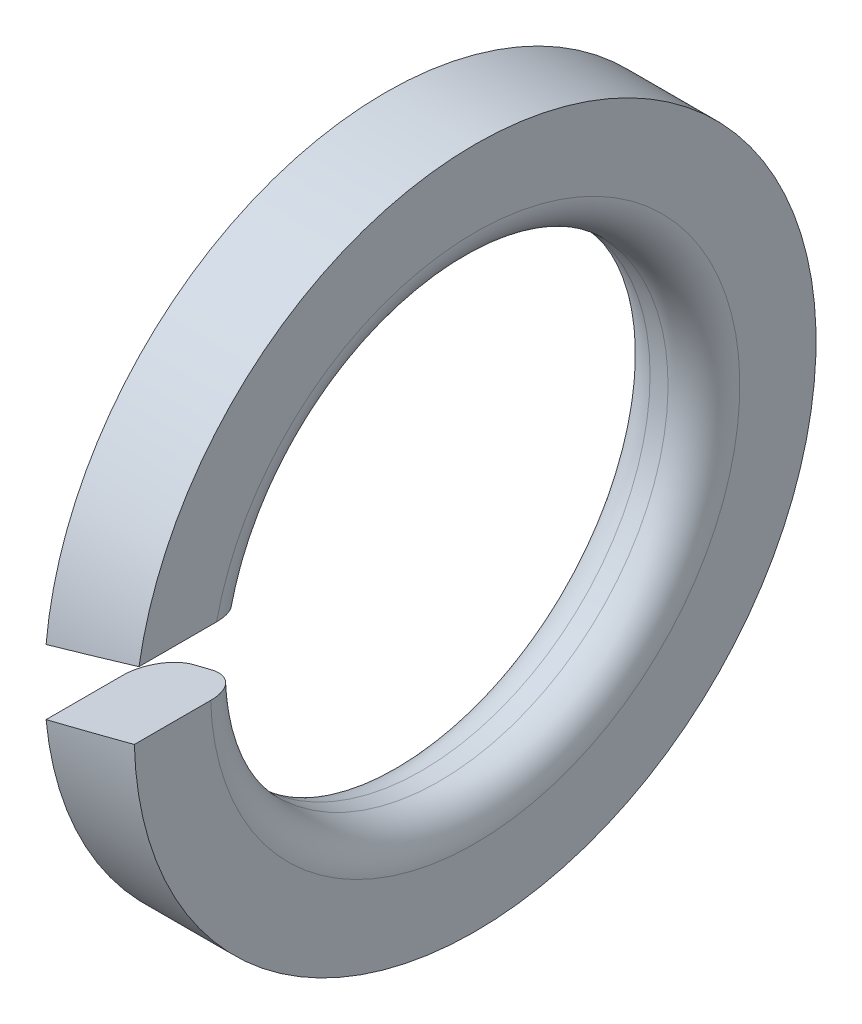
ISO-10303-21;
HEADER;
FILE_DESCRIPTION(('STEP AP214'),'2;1');
FILE_NAME('part.step','',(''),(''),'','','');
FILE_SCHEMA(('AUTOMOTIVE_DESIGN { 1 0 10303 214 1 1 1 1 }'));
ENDSEC;
DATA;
#1=APPLICATION_CONTEXT('core data for automotive mechanical design processes');
#2=APPLICATION_PROTOCOL_DEFINITION('international standard','automotive_design',2000,#1);
#3=PRODUCT_CONTEXT('',#1,'mechanical');
#4=PRODUCT('Part','Part','',(#3));
#5=PRODUCT_RELATED_PRODUCT_CATEGORY('part','',(#4));
#6=PRODUCT_DEFINITION_FORMATION('','',#4);
#7=PRODUCT_DEFINITION_CONTEXT('part definition',#1,'design');
#8=PRODUCT_DEFINITION('design','',#6,#7);
#9=PRODUCT_DEFINITION_SHAPE('','',#8);
#10=(LENGTH_UNIT() NAMED_UNIT(*) SI_UNIT(.MILLI.,.METRE.));
#11=(NAMED_UNIT(*) PLANE_ANGLE_UNIT() SI_UNIT($,.RADIAN.));
#12=(NAMED_UNIT(*) SI_UNIT($,.STERADIAN.) SOLID_ANGLE_UNIT());
#13=UNCERTAINTY_MEASURE_WITH_UNIT(LENGTH_MEASURE(1.E-05),#10,'distance_accuracy_value','');
#14=(GEOMETRIC_REPRESENTATION_CONTEXT(3) GLOBAL_UNCERTAINTY_ASSIGNED_CONTEXT((#13)) GLOBAL_UNIT_ASSIGNED_CONTEXT((#10,
#11,#12)) REPRESENTATION_CONTEXT('',''));
#15=CARTESIAN_POINT('',(0.,0.,0.));
#16=DIRECTION('',(0.,0.,1.));
#17=DIRECTION('',(1.,0.,0.));
#18=AXIS2_PLACEMENT_3D('',#15,#16,#17);
#19=CARTESIAN_POINT('',(1.,0.,0.));
#20=DIRECTION('',(1.,0.,0.));
#21=DIRECTION('',(0.,0.,-1.));
#22=AXIS2_PLACEMENT_3D('',#19,#20,#21);
#23=CYLINDRICAL_SURFACE('',#22,5.1);
#24=CARTESIAN_POINT('',(-2.70459231360937,0.,0.));
#25=DIRECTION('',(0.258819045102526,-0.965925826289067,0.));
#26=DIRECTION('',(0.965925826289067,0.258819045102526,0.));
#27=AXIS2_PLACEMENT_3D('',#24,#25,#26);
#28=ELLIPSE('',#27,19.7048868562966,5.1);
#29=CARTESIAN_POINT('',(1.19999999999987,1.04623235720439,4.99153261581436));
#30=VERTEX_POINT('',#29);
#31=CARTESIAN_POINT('',(0.800000000000133,0.939052680232006,5.01280161823197));
#32=VERTEX_POINT('',#31);
#33=EDGE_CURVE('E236',#30,#32,#28,.T.);
#34=ORIENTED_EDGE('',*,*,#33,.T.);
#35=CARTESIAN_POINT('',(0.800000000000131,0.,0.));
#36=DIRECTION('',(-1.,0.,0.));
#37=DIRECTION('',(0.,0.,1.));
#38=AXIS2_PLACEMENT_3D('',#35,#36,#37);
#39=CIRCLE('',#38,5.1);
#40=CARTESIAN_POINT('',(0.800000000000133,-0.510333972342123,5.07440235265923));
#41=VERTEX_POINT('',#40);
#42=EDGE_CURVE('E259',#32,#41,#39,.T.);
#43=ORIENTED_EDGE('',*,*,#42,.T.);
#44=CARTESIAN_POINT('',(2.70459231360939,0.,0.));
#45=DIRECTION('',(-0.25881904510252,0.965925826289069,0.));
#46=DIRECTION('',(0.965925826289069,0.25881904510252,0.));
#47=AXIS2_PLACEMENT_3D('',#44,#45,#46);
#48=ELLIPSE('',#47,19.7048868562971,5.1);
#49=CARTESIAN_POINT('',(1.19999999999986,-0.403154295369749,5.08404038281807));
#50=VERTEX_POINT('',#49);
#51=EDGE_CURVE('E134',#41,#50,#48,.T.);
#52=ORIENTED_EDGE('',*,*,#51,.T.);
#53=CARTESIAN_POINT('',(1.19999999999987,0.,0.));
#54=DIRECTION('',(1.,0.,0.));
#55=DIRECTION('',(0.,1.,0.));
#56=AXIS2_PLACEMENT_3D('',#53,#54,#55);
#57=CIRCLE('',#56,5.1);
#58=EDGE_CURVE('E256',#50,#30,#57,.T.);
#59=ORIENTED_EDGE('',*,*,#58,.T.);
#60=EDGE_LOOP('',(#34,#43,#52,#59));
#61=FACE_BOUND('',#60,.T.);
#62=ADVANCED_FACE('F47',(#61),#23,.F.);
#63=CARTESIAN_POINT('',(3.75,1.7295027979038,20.4));
#64=DIRECTION('',(0.258819045102526,-0.965925826289067,0.));
#65=DIRECTION('',(0.965925826289067,0.258819045102526,0.));
#66=AXIS2_PLACEMENT_3D('',#63,#64,#65);
#67=PLANE('',#66);
#68=DIRECTION('',(0.,0.,1.));
#69=VECTOR('',#68,1.);
#70=CARTESIAN_POINT('',(0.,0.724693326287068,5.85532403738982));
#71=LINE('',#70,#69);
#72=CARTESIAN_POINT('',(0.,0.724693326287068,5.85532403738995));
#73=VERTEX_POINT('',#72);
#74=CARTESIAN_POINT('',(0.,0.724693326287068,7.56536975850057));
#75=VERTEX_POINT('',#74);
#76=EDGE_CURVE('E119',#73,#75,#71,.T.);
#77=ORIENTED_EDGE('',*,*,#76,.F.);
#78=CARTESIAN_POINT('',(0.,0.724693326287068,5.85532403738995));
#79=CARTESIAN_POINT('',(-4.13021268271379E-05,0.724682259415539,5.80958910187213));
#80=CARTESIAN_POINT('',(0.00385901532518789,0.725727346327032,5.7639013076482));
#81=CARTESIAN_POINT('',(0.0190646830267989,0.729801692708054,5.67398773396352));
#82=CARTESIAN_POINT('',(0.0303497647310732,0.732825521237234,5.62975829983374));
#83=CARTESIAN_POINT('',(0.059841742861338,0.740727872960435,5.54389422805747));
#84=CARTESIAN_POINT('',(0.0780440207299473,0.745605158615736,5.50225788057024));
#85=CARTESIAN_POINT('',(0.120701278801175,0.757035136467247,5.42256235636293));
#86=CARTESIAN_POINT('',(0.145159052874325,0.763588577278811,5.38450478843515));
#87=CARTESIAN_POINT('',(0.200580223629634,0.778438635226284,5.31151658827088));
#88=CARTESIAN_POINT('',(0.231752960841521,0.786791344988077,5.27675644462985));
#89=CARTESIAN_POINT('',(0.299083817997774,0.80483259378879,5.21284748740653));
#90=CARTESIAN_POINT('',(0.335244198158635,0.814521738450896,5.18370123226418));
#91=CARTESIAN_POINT('',(0.413295096436519,0.835435413612979,5.13053280062713));
#92=CARTESIAN_POINT('',(0.455370777265773,0.846709558312167,5.10680189795339));
#93=CARTESIAN_POINT('',(0.542716923985904,0.870113887787797,5.0668922146618));
#94=CARTESIAN_POINT('',(0.587984464922859,0.882243288825198,5.05070662061781));
#95=CARTESIAN_POINT('',(0.661360801668644,0.901904418999785,5.03142581339343));
#96=CARTESIAN_POINT('',(0.688844253396886,0.909268587695588,5.02568490815635));
#97=CARTESIAN_POINT('',(0.744190223105595,0.924098495583354,5.01707601129011));
#98=CARTESIAN_POINT('',(0.772052195750279,0.931564088653035,5.01420425589513));
#99=CARTESIAN_POINT('',(0.800000000000131,0.939052680232006,5.01280161823197));
#100=B_SPLINE_CURVE_WITH_KNOTS('',3,(#78,#79,#80,#81,#82,#83,#84,#85,#86,#87,#88,#89,#90,#91,
#92,#93,#94,#95,#96,#97,#98,#99),.UNSPECIFIED.,.F.,.F.,(4,2,2,2,2,2,2,2,2,2,4),(0.,
0.136956996721194,0.273539663080258,0.410031294044572,0.546583992568295,0.688250795700725,
0.82998200924122,0.978121638157468,1.12612723637942,1.21307486987278,1.29990829465358),.UNSPECIFIED.);
#101=EDGE_CURVE('E56',#73,#32,#100,.T.);
#102=ORIENTED_EDGE('',*,*,#101,.T.);
#103=ORIENTED_EDGE('',*,*,#33,.F.);
#104=CARTESIAN_POINT('',(1.19999999999987,1.04623235720439,4.99153261581436));
#105=CARTESIAN_POINT('',(1.24393420548372,1.05800449208389,4.98902773841229));
#106=CARTESIAN_POINT('',(1.28809805516041,1.06983815993941,4.99023849268285));
#107=CARTESIAN_POINT('',(1.37570521423646,1.09331242746502,5.00015520268051));
#108=CARTESIAN_POINT('',(1.41914715436426,1.10495266023991,5.00887404045822));
#109=CARTESIAN_POINT('',(1.50406090464332,1.12770523105348,5.03390638760815));
#110=CARTESIAN_POINT('',(1.54552834125039,1.13881639720453,5.05023596419253));
#111=CARTESIAN_POINT('',(1.62499861276788,1.16011039227992,5.09019132333186));
#112=CARTESIAN_POINT('',(1.66300531430431,1.17029425726358,5.11380883036818));
#113=CARTESIAN_POINT('',(1.73274040778593,1.18897971924609,5.16655051055211));
#114=CARTESIAN_POINT('',(1.76467063774216,1.197535398577,5.19538879452435));
#115=CARTESIAN_POINT('',(1.82322237830408,1.21322429017601,5.25836469991298));
#116=CARTESIAN_POINT('',(1.84984368594787,1.22035744806062,5.29250252384389));
#117=CARTESIAN_POINT('',(1.89628723725722,1.2328019601276,5.36394736200637));
#118=CARTESIAN_POINT('',(1.91628684621141,1.23816083919581,5.40113121624091));
#119=CARTESIAN_POINT('',(1.95006163191809,1.24721076575045,5.47842093294454));
#120=CARTESIAN_POINT('',(1.96383632284738,1.25090168306094,5.51852702319575));
#121=CARTESIAN_POINT('',(1.98292654888246,1.25601689371037,5.59280723088154));
#122=CARTESIAN_POINT('',(1.98934352048726,1.25773631606973,5.62668468736508));
#123=CARTESIAN_POINT('',(1.99788244481348,1.26002431394717,5.69496146366873));
#124=CARTESIAN_POINT('',(2.00001121586477,1.26059471643123,5.72935986727445));
#125=CARTESIAN_POINT('',(2.,1.26059171114933,5.76375819563791));
#126=B_SPLINE_CURVE_WITH_KNOTS('',3,(#104,#105,#106,#107,#108,#109,#110,#111,#112,#113,#114,
#115,#116,#117,#118,#119,#120,#121,#122,#123,#124,#125),.UNSPECIFIED.,.F.,.F.,(4,2,2,2,2,2,2,2,
2,2,4),(0.,0.136564725547741,0.273364230962835,0.410453854400352,0.547388380465582,
0.678336231716942,0.809289088190013,0.936379834854634,1.06348049859402,1.16676478182081,
1.26988471080674),.UNSPECIFIED.);
#127=CARTESIAN_POINT('',(2.,1.26059171114932,5.76375819563791));
#128=VERTEX_POINT('',#127);
#129=EDGE_CURVE('E63',#30,#128,#126,.T.);
#130=ORIENTED_EDGE('',*,*,#129,.T.);
#131=DIRECTION('',(0.,0.,-1.));
#132=VECTOR('',#131,1.);
#133=CARTESIAN_POINT('',(2.,1.26059171114932,7.49472538107846));
#134=LINE('',#133,#132);
#135=CARTESIAN_POINT('',(2.,1.26059171114932,7.49472538107846));
#136=VERTEX_POINT('',#135);
#137=EDGE_CURVE('E103',#136,#128,#134,.T.);
#138=ORIENTED_EDGE('',*,*,#137,.F.);
#139=CARTESIAN_POINT('',(-2.57082658113028E-09,0.724693325598216,7.56536975856656));
#140=CARTESIAN_POINT('',(0.041769776378902,0.735885503986067,7.56429764958392));
#141=CARTESIAN_POINT('',(0.0835389561085949,0.74707751965438,7.56320049280552));
#142=CARTESIAN_POINT('',(0.167076056917617,0.769461211913324,7.56095602171306));
#143=CARTESIAN_POINT('',(0.208843977996999,0.780652888503968,7.55980870740109));
#144=CARTESIAN_POINT('',(0.292378503510215,0.803035889562502,7.55746385924354));
#145=CARTESIAN_POINT('',(0.334145107944088,0.814227214030402,7.55626632539947));
#146=CARTESIAN_POINT('',(0.417676942151504,0.836609496697694,7.55382097264458));
#147=CARTESIAN_POINT('',(0.459442171925069,0.847800454897093,7.55257315373461));
#148=CARTESIAN_POINT('',(0.542971198803423,0.870181990025848,7.55002716273198));
#149=CARTESIAN_POINT('',(0.584734995908214,0.881372566955205,7.54872899063941));
#150=CARTESIAN_POINT('',(0.668261099434838,0.903753323596017,7.54608222231995));
#151=CARTESIAN_POINT('',(0.710023405856647,0.914943503307464,7.54473362609229));
#152=CARTESIAN_POINT('',(0.793546470019769,0.937323448504159,7.54198593580142));
#153=CARTESIAN_POINT('',(0.835307227761028,0.948513213989391,7.54058684173646));
#154=CARTESIAN_POINT('',(0.918827136504696,0.970892312980168,7.53773807925654));
#155=CARTESIAN_POINT('',(0.960586287507015,0.982081646485688,7.53628841083875));
#156=CARTESIAN_POINT('',(1.04392083768516,1.00441107150701,7.53334485224312));
#157=CARTESIAN_POINT('',(1.08549624411779,1.01555116499266,7.53185118245385));
#158=CARTESIAN_POINT('',(1.16864534019512,1.03783088953216,7.52881354849861));
#159=CARTESIAN_POINT('',(1.21021902983995,1.04897052058604,7.52726958433644));
#160=CARTESIAN_POINT('',(1.29336463252532,1.07124930757098,7.52413127672263));
#161=CARTESIAN_POINT('',(1.33493654556597,1.08238846350206,7.52253693327369));
#162=CARTESIAN_POINT('',(1.41807853531782,1.10466628609021,7.51929777936313));
#163=CARTESIAN_POINT('',(1.45964861202908,1.11580495274729,7.517652968903));
#164=CARTESIAN_POINT('',(1.54278686937317,1.13808178149297,7.51431279041191));
#165=CARTESIAN_POINT('',(1.58435505000599,1.14921994358157,7.51261742238108));
#166=CARTESIAN_POINT('',(1.66748945544844,1.17149574658489,7.50917603530616));
#167=CARTESIAN_POINT('',(1.70905568025801,1.18263338749959,7.50743001626069));
#168=CARTESIAN_POINT('',(1.79218611431614,1.20490813035264,7.50388723108745));
#169=CARTESIAN_POINT('',(1.83375032356459,1.21604523229095,7.50209046495666));
#170=CARTESIAN_POINT('',(1.91687666673058,1.23831887766352,7.49844608597269));
#171=CARTESIAN_POINT('',(1.95843880064793,1.24945542109773,7.4965984731147));
#172=CARTESIAN_POINT('',(1.9999998643116,1.26059167479173,7.4947253871937));
#173=B_SPLINE_CURVE_WITH_KNOTS('',3,(#139,#140,#141,#142,#143,#144,#145,#146,#147,#148,#149,
#150,#151,#152,#153,#154,#155,#156,#157,#158,#159,#160,#161,#162,#163,#164,#165,#166,#167,#168,
#169,#170,#171,#172),.UNSPECIFIED.,.F.,.F.,(4,2,2,2,2,2,2,2,2,2,2,2,2,2,2,2,4),(0.,
0.129769628656478,0.259539251916842,0.38930887126657,0.519078488425523,0.648848105358273,
0.778617724284428,0.908387347688962,1.03815697833254,1.16736075843193,1.29656452877806,
1.42576829219191,1.55497205181877,1.68417581113912,1.81337957397955,1.94258334452365,
2.07178712732294),.UNSPECIFIED.);
#174=EDGE_CURVE('E116',#75,#136,#173,.T.);
#175=ORIENTED_EDGE('',*,*,#174,.F.);
#176=EDGE_LOOP('',(#77,#102,#103,#130,#138,#175));
#177=FACE_BOUND('',#176,.T.);
#178=ADVANCED_FACE('F115',(#177),#67,.T.);
#179=CARTESIAN_POINT('',(-2.,-1.2605917111493,20.4));
#180=DIRECTION('',(-0.25881904510252,0.965925826289069,0.));
#181=DIRECTION('',(-0.965925826289069,-0.25881904510252,0.));
#182=AXIS2_PLACEMENT_3D('',#179,#180,#181);
#183=PLANE('',#182);
#184=ORIENTED_EDGE('',*,*,#51,.F.);
#185=CARTESIAN_POINT('',(0.800000000000131,-0.510333972342124,5.07440235265923));
#186=CARTESIAN_POINT('',(0.754581800957133,-0.522503742097371,5.07314586077715));
#187=CARTESIAN_POINT('',(0.709044867625601,-0.534705326609345,5.07579351926906));
#188=CARTESIAN_POINT('',(0.618958891063611,-0.558843791278499,5.08884053680391));
#189=CARTESIAN_POINT('',(0.57441128178762,-0.570780287208738,5.09925047643376));
#190=CARTESIAN_POINT('',(0.487591089550076,-0.594043687605503,5.12779132682406));
#191=CARTESIAN_POINT('',(0.445322255311291,-0.60536958760479,5.14593454744));
#192=CARTESIAN_POINT('',(0.364522247428579,-0.627019884465391,5.18957275484894));
#193=CARTESIAN_POINT('',(0.325987668742471,-0.637345193705007,5.21506095828026));
#194=CARTESIAN_POINT('',(0.255243740894678,-0.656300972041229,5.27170873111954));
#195=CARTESIAN_POINT('',(0.222855512222933,-0.664979371758098,5.30262873710148));
#196=CARTESIAN_POINT('',(0.163805710183078,-0.680801718527894,5.3698749378282));
#197=CARTESIAN_POINT('',(0.137144275722872,-0.687945628360562,5.40620126367137));
#198=CARTESIAN_POINT('',(0.091367312328636,-0.700211528733996,5.48163483615063));
#199=CARTESIAN_POINT('',(0.071995807564345,-0.705402107791764,5.52057606565338));
#200=CARTESIAN_POINT('',(0.0399354051793038,-0.713992666719852,5.60129564974915));
#201=CARTESIAN_POINT('',(0.027242983476128,-0.717393590865214,5.64307249502324));
#202=CARTESIAN_POINT('',(0.0120338039636971,-0.721468878233109,5.7134824106915));
#203=CARTESIAN_POINT('',(0.00751655425657514,-0.722679271644142,5.7416708879978));
#204=CARTESIAN_POINT('',(0.00150003489368027,-0.724291393148676,5.79834458965508));
#205=CARTESIAN_POINT('',(-4.16508828797296E-06,-0.7246944423191,5.82682925243369));
#206=CARTESIAN_POINT('',(0.,-0.724693326287057,5.85532403738995));
#207=B_SPLINE_CURVE_WITH_KNOTS('',3,(#185,#186,#187,#188,#189,#190,#191,#192,#193,#194,#195,
#196,#197,#198,#199,#200,#201,#202,#203,#204,#205,#206),.UNSPECIFIED.,.F.,.F.,(4,2,2,2,2,2,2,2,
2,2,4),(0.,0.140985879343824,0.282164285403012,0.423568263822309,0.564842066710413,
0.700985615536537,0.837132466258856,0.967913748344917,1.09862595698166,1.18418661893898,
1.2696071611687),.UNSPECIFIED.);
#208=CARTESIAN_POINT('',(0.,-0.724693326287056,5.85532403738995));
#209=VERTEX_POINT('',#208);
#210=EDGE_CURVE('E159',#41,#209,#207,.T.);
#211=ORIENTED_EDGE('',*,*,#210,.T.);
#212=DIRECTION('',(0.,0.,-1.));
#213=VECTOR('',#212,1.);
#214=CARTESIAN_POINT('',(0.,-0.724693326287056,7.56536975850057));
#215=LINE('',#214,#213);
#216=CARTESIAN_POINT('',(0.,-0.724693326287056,7.56536975850057));
#217=VERTEX_POINT('',#216);
#218=EDGE_CURVE('E125',#217,#209,#215,.T.);
#219=ORIENTED_EDGE('',*,*,#218,.F.);
#220=CARTESIAN_POINT('',(2.70459231360939,0.,0.));
#221=DIRECTION('',(-0.25881904510252,0.965925826289069,0.));
#222=DIRECTION('',(0.965925826289069,0.25881904510252,0.));
#223=AXIS2_PLACEMENT_3D('',#220,#221,#222);
#224=ELLIPSE('',#223,29.3641451191878,7.6);
#225=CARTESIAN_POINT('',(2.,-0.188794941424814,7.59765466904705));
#226=VERTEX_POINT('',#225);
#227=EDGE_CURVE('E194',#226,#217,#224,.F.);
#228=ORIENTED_EDGE('',*,*,#227,.F.);
#229=DIRECTION('',(0.,0.,1.));
#230=VECTOR('',#229,1.);
#231=CARTESIAN_POINT('',(2.,-0.188794941424814,7.49472538107846));
#232=LINE('',#231,#230);
#233=CARTESIAN_POINT('',(2.,-0.188794941424814,5.89697858823431));
#234=VERTEX_POINT('',#233);
#235=EDGE_CURVE('E106',#234,#226,#232,.T.);
#236=ORIENTED_EDGE('',*,*,#235,.F.);
#237=CARTESIAN_POINT('',(2.,-0.188794941424814,5.89697858823431));
#238=CARTESIAN_POINT('',(2.00004364342429,-0.188783247204519,5.85269825621154));
#239=CARTESIAN_POINT('',(1.99633057953874,-0.189778159674099,5.80844557874552));
#240=CARTESIAN_POINT('',(1.98176123394482,-0.19368200406024,5.72131157153773));
#241=CARTESIAN_POINT('',(1.97092013929847,-0.196586866615796,5.67842752900523));
#242=CARTESIAN_POINT('',(1.9424632893719,-0.204211856572756,5.59515193793114));
#243=CARTESIAN_POINT('',(1.92484811300748,-0.208931828854133,5.55476017674037));
#244=CARTESIAN_POINT('',(1.88345851720527,-0.220022137624385,5.47751422089144));
#245=CARTESIAN_POINT('',(1.85968283796427,-0.226392811676514,5.44066075191793));
#246=CARTESIAN_POINT('',(1.80613515575983,-0.240740869879753,5.37062759554644));
#247=CARTESIAN_POINT('',(1.77624217977602,-0.248750668653978,5.33754716968831));
#248=CARTESIAN_POINT('',(1.71170492185612,-0.266043374795334,5.27678800145436));
#249=CARTESIAN_POINT('',(1.67705903280961,-0.275326712786403,5.24911109388236));
#250=CARTESIAN_POINT('',(1.60243920490463,-0.295321035412891,5.19872144122565));
#251=CARTESIAN_POINT('',(1.56230187604133,-0.306075800268155,5.17626821759148));
#252=CARTESIAN_POINT('',(1.47904810268219,-0.328383581606582,5.13840298096048));
#253=CARTESIAN_POINT('',(1.43593258115768,-0.339936350780319,5.1229887976667));
#254=CARTESIAN_POINT('',(1.36055309720809,-0.360134222630487,5.10292539294459));
#255=CARTESIAN_POINT('',(1.32872937855063,-0.36866136234491,5.09645582990269));
#256=CARTESIAN_POINT('',(1.26462091477265,-0.385839173442219,5.08735819370303));
#257=CARTESIAN_POINT('',(1.23233690225594,-0.394489648524506,5.08472458329559));
#258=CARTESIAN_POINT('',(1.19999999999986,-0.403154295369747,5.08404038281807));
#259=B_SPLINE_CURVE_WITH_KNOTS('',3,(#237,#238,#239,#240,#241,#242,#243,#244,#245,#246,#247,
#248,#249,#250,#251,#252,#253,#254,#255,#256,#257,#258),.UNSPECIFIED.,.F.,.F.,(4,2,2,2,2,2,2,2,
2,2,4),(0.,0.132632726849375,0.264983776684934,0.39732351825785,0.529690344274733,
0.664984258384064,0.800324032927295,0.941388964544218,1.08241037320554,1.18292559159137,
1.28329557060327),.UNSPECIFIED.);
#260=EDGE_CURVE('E261',#234,#50,#259,.T.);
#261=ORIENTED_EDGE('',*,*,#260,.T.);
#262=EDGE_LOOP('',(#184,#211,#219,#228,#236,#261));
#263=FACE_BOUND('',#262,.T.);
#264=ADVANCED_FACE('F147',(#263),#183,.T.);
#265=CARTESIAN_POINT('',(1.,0.,0.));
#266=DIRECTION('',(1.,0.,0.));
#267=DIRECTION('',(0.,0.,-1.));
#268=AXIS2_PLACEMENT_3D('',#265,#266,#267);
#269=CYLINDRICAL_SURFACE('',#268,7.6);
#270=CARTESIAN_POINT('',(2.,0.,0.));
#271=DIRECTION('',(1.,0.,0.));
#272=DIRECTION('',(0.,1.,0.));
#273=AXIS2_PLACEMENT_3D('',#270,#271,#272);
#274=CIRCLE('',#273,7.6);
#275=EDGE_CURVE('E101',#226,#136,#274,.T.);
#276=ORIENTED_EDGE('',*,*,#275,.F.);
#277=ORIENTED_EDGE('',*,*,#227,.T.);
#278=CARTESIAN_POINT('',(0.,0.,0.));
#279=DIRECTION('',(1.,0.,0.));
#280=DIRECTION('',(0.,-0.0953543850377706,0.995443389276391));
#281=AXIS2_PLACEMENT_3D('',#278,#279,#280);
#282=CIRCLE('',#281,7.6);
#283=EDGE_CURVE('E112',#217,#75,#282,.T.);
#284=ORIENTED_EDGE('',*,*,#283,.T.);
#285=ORIENTED_EDGE('',*,*,#174,.T.);
#286=EDGE_LOOP('',(#276,#277,#284,#285));
#287=FACE_BOUND('',#286,.T.);
#288=ADVANCED_FACE('F123',(#287),#269,.T.);
#289=CARTESIAN_POINT('',(0.,0.,7.6));
#290=DIRECTION('',(-1.,0.,0.));
#291=DIRECTION('',(0.,0.,1.));
#292=AXIS2_PLACEMENT_3D('',#289,#290,#291);
#293=PLANE('',#292);
#294=ORIENTED_EDGE('',*,*,#218,.T.);
#295=CARTESIAN_POINT('',(0.,0.,0.));
#296=DIRECTION('',(-1.,0.,0.));
#297=DIRECTION('',(0.,0.,1.));
#298=AXIS2_PLACEMENT_3D('',#295,#296,#297);
#299=CIRCLE('',#298,5.90000000000013);
#300=EDGE_CURVE('E71',#209,#73,#299,.F.);
#301=ORIENTED_EDGE('',*,*,#300,.T.);
#302=ORIENTED_EDGE('',*,*,#76,.T.);
#303=ORIENTED_EDGE('',*,*,#283,.F.);
#304=EDGE_LOOP('',(#294,#301,#302,#303));
#305=FACE_BOUND('',#304,.T.);
#306=ADVANCED_FACE('F146',(#305),#293,.T.);
#307=CARTESIAN_POINT('',(2.,1.26059171114932,7.49472538107846));
#308=DIRECTION('',(1.,0.,0.));
#309=DIRECTION('',(0.,1.,0.));
#310=AXIS2_PLACEMENT_3D('',#307,#308,#309);
#311=PLANE('',#310);
#312=ORIENTED_EDGE('',*,*,#137,.T.);
#313=CARTESIAN_POINT('',(2.,0.,0.));
#314=DIRECTION('',(1.,0.,0.));
#315=DIRECTION('',(0.,1.,0.));
#316=AXIS2_PLACEMENT_3D('',#313,#314,#315);
#317=CIRCLE('',#316,5.90000000000013);
#318=EDGE_CURVE('E12',#128,#234,#317,.F.);
#319=ORIENTED_EDGE('',*,*,#318,.T.);
#320=ORIENTED_EDGE('',*,*,#235,.T.);
#321=ORIENTED_EDGE('',*,*,#275,.T.);
#322=EDGE_LOOP('',(#312,#319,#320,#321));
#323=FACE_BOUND('',#322,.T.);
#324=ADVANCED_FACE('F102',(#323),#311,.T.);
#325=CARTESIAN_POINT('',(0.800000000000131,0.,0.));
#326=DIRECTION('',(-1.,0.,0.));
#327=DIRECTION('',(0.,0.,1.));
#328=AXIS2_PLACEMENT_3D('',#325,#326,#327);
#329=TOROIDAL_SURFACE('',#328,5.90000000000013,0.800000000000131);
#330=ORIENTED_EDGE('',*,*,#101,.F.);
#331=ORIENTED_EDGE('',*,*,#300,.F.);
#332=ORIENTED_EDGE('',*,*,#210,.F.);
#333=ORIENTED_EDGE('',*,*,#42,.F.);
#334=EDGE_LOOP('',(#330,#331,#332,#333));
#335=FACE_BOUND('',#334,.T.);
#336=ADVANCED_FACE('F153',(#335),#329,.T.);
#337=CARTESIAN_POINT('',(1.19999999999986,0.,0.));
#338=DIRECTION('',(1.,0.,0.));
#339=DIRECTION('',(0.,1.,0.));
#340=AXIS2_PLACEMENT_3D('',#337,#338,#339);
#341=TOROIDAL_SURFACE('',#340,5.90000000000013,0.800000000000131);
#342=ORIENTED_EDGE('',*,*,#260,.F.);
#343=ORIENTED_EDGE('',*,*,#318,.F.);
#344=ORIENTED_EDGE('',*,*,#129,.F.);
#345=ORIENTED_EDGE('',*,*,#58,.F.);
#346=EDGE_LOOP('',(#342,#343,#344,#345));
#347=FACE_BOUND('',#346,.T.);
#348=ADVANCED_FACE('F49',(#347),#341,.T.);
#349=CLOSED_SHELL('',(#62,#178,#264,#288,#306,#324,#336,#348));
#350=MANIFOLD_SOLID_BREP('B2',#349);
#351=ADVANCED_BREP_SHAPE_REPRESENTATION('',(#18,#350),#14);
#352=SHAPE_DEFINITION_REPRESENTATION(#9,#351);
ENDSEC;
END-ISO-10303-21;
